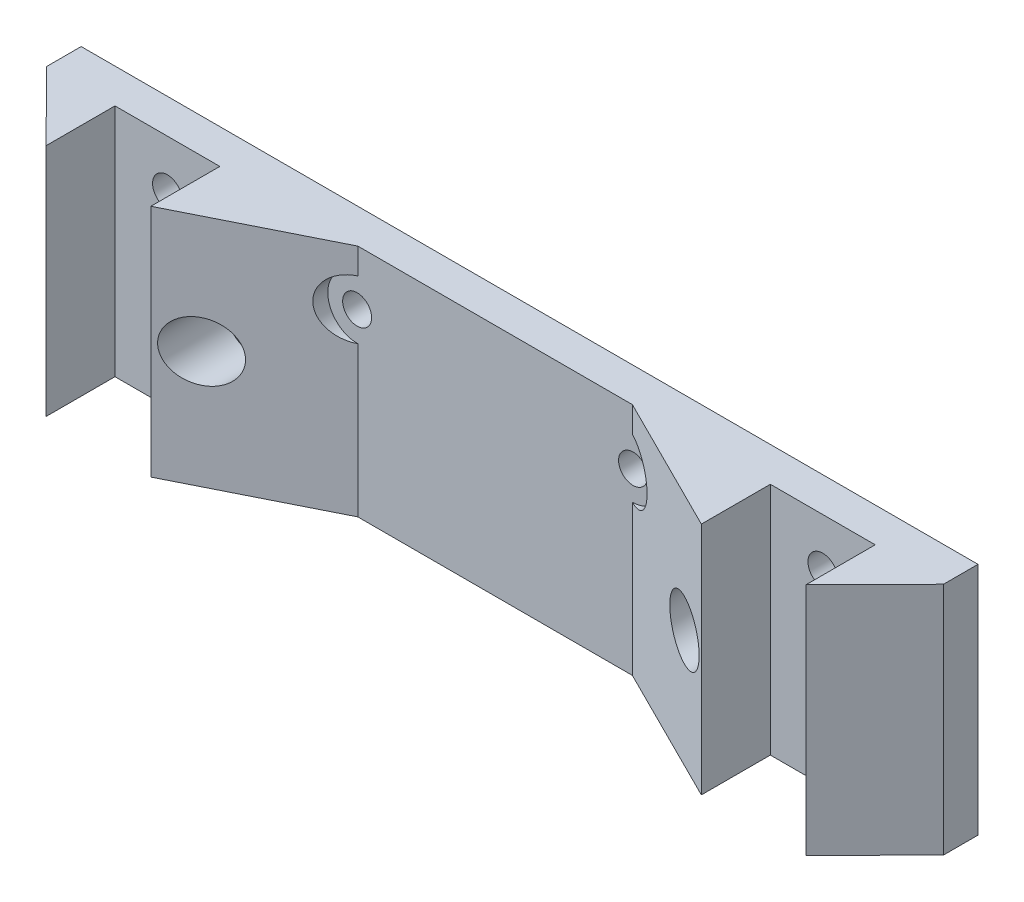
ISO-10303-21;
HEADER;
FILE_DESCRIPTION(('STEP AP214'),'2;1');
FILE_NAME('part.step','',(''),(''),'','','');
FILE_SCHEMA(('AUTOMOTIVE_DESIGN { 1 0 10303 214 1 1 1 1 }'));
ENDSEC;
DATA;
#1=APPLICATION_CONTEXT('core data for automotive mechanical design processes');
#2=APPLICATION_PROTOCOL_DEFINITION('international standard','automotive_design',2000,#1);
#3=PRODUCT_CONTEXT('',#1,'mechanical');
#4=PRODUCT('Part','Part','',(#3));
#5=PRODUCT_RELATED_PRODUCT_CATEGORY('part','',(#4));
#6=PRODUCT_DEFINITION_FORMATION('','',#4);
#7=PRODUCT_DEFINITION_CONTEXT('part definition',#1,'design');
#8=PRODUCT_DEFINITION('design','',#6,#7);
#9=PRODUCT_DEFINITION_SHAPE('','',#8);
#10=(LENGTH_UNIT() NAMED_UNIT(*) SI_UNIT(.MILLI.,.METRE.));
#11=(NAMED_UNIT(*) PLANE_ANGLE_UNIT() SI_UNIT($,.RADIAN.));
#12=(NAMED_UNIT(*) SI_UNIT($,.STERADIAN.) SOLID_ANGLE_UNIT());
#13=UNCERTAINTY_MEASURE_WITH_UNIT(LENGTH_MEASURE(1.E-05),#10,'distance_accuracy_value','');
#14=(GEOMETRIC_REPRESENTATION_CONTEXT(3) GLOBAL_UNCERTAINTY_ASSIGNED_CONTEXT((#13)) GLOBAL_UNIT_ASSIGNED_CONTEXT((#10,
#11,#12)) REPRESENTATION_CONTEXT('',''));
#15=CARTESIAN_POINT('',(0.,0.,0.));
#16=DIRECTION('',(0.,0.,1.));
#17=DIRECTION('',(1.,0.,0.));
#18=AXIS2_PLACEMENT_3D('',#15,#16,#17);
#19=CARTESIAN_POINT('',(-39.8999999999967,110.499923245137,15.));
#20=DIRECTION('',(0.447213595499958,0.,0.894427190999916));
#21=DIRECTION('',(0.894427190999916,0.,-0.447213595499958));
#22=AXIS2_PLACEMENT_3D('',#19,#20,#21);
#23=PLANE('',#22);
#24=DIRECTION('',(0.,-1.,0.));
#25=VECTOR('',#24,1.);
#26=CARTESIAN_POINT('',(-19.8999999999967,110.499923245137,5.));
#27=LINE('',#26,#25);
#28=CARTESIAN_POINT('',(-19.8999999999967,98.2510998786033,5.));
#29=VERTEX_POINT('',#28);
#30=CARTESIAN_POINT('',(-19.8999999999967,76.4999232451366,5.));
#31=VERTEX_POINT('',#30);
#32=EDGE_CURVE('E195',#29,#31,#27,.T.);
#33=ORIENTED_EDGE('',*,*,#32,.F.);
#34=CARTESIAN_POINT('',(-20.0000000000005,102.499923245137,5.05000000000191));
#35=DIRECTION('',(0.447213595499958,0.,0.894427190999916));
#36=DIRECTION('',(0.894427190999916,0.,-0.447213595499958));
#37=AXIS2_PLACEMENT_3D('',#34,#35,#36);
#38=ELLIPSE('',#37,4.75164445218705,4.25);
#39=CARTESIAN_POINT('',(-19.8999999999967,106.74874661167,5.));
#40=VERTEX_POINT('',#39);
#41=EDGE_CURVE('E11',#29,#40,#38,.F.);
#42=ORIENTED_EDGE('',*,*,#41,.T.);
#43=CARTESIAN_POINT('',(-19.8999999999967,110.499923245137,5.));
#44=VERTEX_POINT('',#43);
#45=EDGE_CURVE('E193',#44,#40,#27,.T.);
#46=ORIENTED_EDGE('',*,*,#45,.F.);
#47=DIRECTION('',(-0.894427190999916,0.,0.447213595499958));
#48=VECTOR('',#47,1.);
#49=CARTESIAN_POINT('',(-39.8999999999967,110.499923245137,15.));
#50=LINE('',#49,#48);
#51=CARTESIAN_POINT('',(-39.8999999999967,110.499923245137,15.));
#52=VERTEX_POINT('',#51);
#53=EDGE_CURVE('E180',#44,#52,#50,.T.);
#54=ORIENTED_EDGE('',*,*,#53,.T.);
#55=DIRECTION('',(0.,-1.,0.));
#56=VECTOR('',#55,1.);
#57=CARTESIAN_POINT('',(-39.8999999999967,110.499923245137,15.));
#58=LINE('',#57,#56);
#59=CARTESIAN_POINT('',(-39.8999999999967,76.4999232451366,15.));
#60=VERTEX_POINT('',#59);
#61=EDGE_CURVE('E190',#52,#60,#58,.T.);
#62=ORIENTED_EDGE('',*,*,#61,.T.);
#63=DIRECTION('',(-0.894427190999916,0.,0.447213595499958));
#64=VECTOR('',#63,1.);
#65=CARTESIAN_POINT('',(-39.8999999999967,76.4999232451366,15.));
#66=LINE('',#65,#64);
#67=EDGE_CURVE('E181',#31,#60,#66,.T.);
#68=ORIENTED_EDGE('',*,*,#67,.F.);
#69=EDGE_LOOP('',(#33,#42,#46,#54,#62,#68));
#70=FACE_BOUND('',#69,.T.);
#71=CARTESIAN_POINT('',(-35.0000000000005,93.4999232451367,12.5500000000019));
#72=DIRECTION('',(0.447213595499958,0.,0.894427190999916));
#73=DIRECTION('',(0.894427190999916,0.,-0.447213595499958));
#74=AXIS2_PLACEMENT_3D('',#71,#72,#73);
#75=ELLIPSE('',#74,4.75164445218705,4.25);
#76=CARTESIAN_POINT('',(-30.7500000000005,93.4999232451367,10.4250000000019));
#77=VERTEX_POINT('',#76);
#78=EDGE_CURVE('E39',#77,#77,#75,.F.);
#79=ORIENTED_EDGE('',*,*,#78,.T.);
#80=EDGE_LOOP('',(#79));
#81=FACE_BOUND('',#80,.T.);
#82=ADVANCED_FACE('F35',(#70,#81),#23,.T.);
#83=CARTESIAN_POINT('',(39.8999999999966,110.499923245137,15.0000000000007));
#84=DIRECTION('',(-0.447213595499974,0.,0.894427190999908));
#85=DIRECTION('',(0.894427190999908,0.,0.447213595499974));
#86=AXIS2_PLACEMENT_3D('',#83,#84,#85);
#87=PLANE('',#86);
#88=DIRECTION('',(0.,-1.,0.));
#89=VECTOR('',#88,1.);
#90=CARTESIAN_POINT('',(19.8999999999968,110.499923245137,5.00000000000035));
#91=LINE('',#90,#89);
#92=CARTESIAN_POINT('',(19.8999999999968,110.499923245137,5.00000000000035));
#93=VERTEX_POINT('',#92);
#94=CARTESIAN_POINT('',(19.8999999999968,106.749923245137,5.00000000000035));
#95=VERTEX_POINT('',#94);
#96=EDGE_CURVE('E158',#93,#95,#91,.T.);
#97=ORIENTED_EDGE('',*,*,#96,.T.);
#98=CARTESIAN_POINT('',(19.8999999999965,102.499923245137,5.00000000000018));
#99=DIRECTION('',(-0.447213595499974,0.,0.894427190999908));
#100=DIRECTION('',(-0.894427190999908,0.,-0.447213595499974));
#101=AXIS2_PLACEMENT_3D('',#98,#99,#100);
#102=ELLIPSE('',#101,4.75164445218709,4.25);
#103=CARTESIAN_POINT('',(19.8999999999961,98.2499232451366,5.));
#104=VERTEX_POINT('',#103);
#105=EDGE_CURVE('E44',#95,#104,#102,.F.);
#106=ORIENTED_EDGE('',*,*,#105,.T.);
#107=CARTESIAN_POINT('',(19.8999999999968,76.4999232451366,5.00000000000035));
#108=VERTEX_POINT('',#107);
#109=EDGE_CURVE('E156',#104,#108,#91,.T.);
#110=ORIENTED_EDGE('',*,*,#109,.T.);
#111=DIRECTION('',(-0.894427190999908,0.,-0.447213595499974));
#112=VECTOR('',#111,1.);
#113=CARTESIAN_POINT('',(39.8999999999966,76.4999232451366,15.0000000000007));
#114=LINE('',#113,#112);
#115=CARTESIAN_POINT('',(39.8999999999966,76.4999232451366,15.0000000000007));
#116=VERTEX_POINT('',#115);
#117=EDGE_CURVE('E319',#116,#108,#114,.T.);
#118=ORIENTED_EDGE('',*,*,#117,.F.);
#119=DIRECTION('',(0.,-1.,0.));
#120=VECTOR('',#119,1.);
#121=CARTESIAN_POINT('',(39.8999999999966,110.499923245137,15.0000000000007));
#122=LINE('',#121,#120);
#123=CARTESIAN_POINT('',(39.8999999999966,110.499923245137,15.0000000000007));
#124=VERTEX_POINT('',#123);
#125=EDGE_CURVE('E166',#124,#116,#122,.T.);
#126=ORIENTED_EDGE('',*,*,#125,.F.);
#127=DIRECTION('',(-0.894427190999908,0.,-0.447213595499974));
#128=VECTOR('',#127,1.);
#129=CARTESIAN_POINT('',(39.8999999999966,110.499923245137,15.0000000000007));
#130=LINE('',#129,#128);
#131=EDGE_CURVE('E169',#124,#93,#130,.T.);
#132=ORIENTED_EDGE('',*,*,#131,.T.);
#133=EDGE_LOOP('',(#97,#106,#110,#118,#126,#132));
#134=FACE_BOUND('',#133,.T.);
#135=CARTESIAN_POINT('',(34.9999999999995,93.4999232451367,12.550000000002));
#136=DIRECTION('',(-0.447213595499974,0.,0.894427190999908));
#137=DIRECTION('',(-0.894427190999908,0.,-0.447213595499974));
#138=AXIS2_PLACEMENT_3D('',#135,#136,#137);
#139=ELLIPSE('',#138,4.7516444521871,4.25000000000001);
#140=CARTESIAN_POINT('',(30.7499999999995,93.4999232451367,10.4250000000019));
#141=VERTEX_POINT('',#140);
#142=EDGE_CURVE('E290',#141,#141,#139,.F.);
#143=ORIENTED_EDGE('',*,*,#142,.T.);
#144=EDGE_LOOP('',(#143));
#145=FACE_BOUND('',#144,.T.);
#146=ADVANCED_FACE('F153',(#134,#145),#87,.T.);
#147=CARTESIAN_POINT('',(0.,0.,5.));
#148=DIRECTION('',(0.,0.,1.));
#149=DIRECTION('',(1.,0.,0.));
#150=AXIS2_PLACEMENT_3D('',#147,#148,#149);
#151=PLANE('',#150);
#152=DIRECTION('',(0.,-1.,0.));
#153=VECTOR('',#152,1.);
#154=CARTESIAN_POINT('',(55.0999999999968,110.499923245137,5.00000000000097));
#155=LINE('',#154,#153);
#156=CARTESIAN_POINT('',(55.0999999999968,110.499923245137,5.00000000000097));
#157=VERTEX_POINT('',#156);
#158=CARTESIAN_POINT('',(55.0999999999967,76.4999232451366,5.));
#159=VERTEX_POINT('',#158);
#160=EDGE_CURVE('E311',#157,#159,#155,.T.);
#161=ORIENTED_EDGE('',*,*,#160,.F.);
#162=DIRECTION('',(-1.,0.,0.));
#163=VECTOR('',#162,1.);
#164=CARTESIAN_POINT('',(-64.9999999999966,110.499923245137,5.));
#165=LINE('',#164,#163);
#166=CARTESIAN_POINT('',(39.8999999999968,110.499923245137,5.0000000000007));
#167=VERTEX_POINT('',#166);
#168=EDGE_CURVE('E269',#157,#167,#165,.T.);
#169=ORIENTED_EDGE('',*,*,#168,.T.);
#170=DIRECTION('',(0.,-1.,0.));
#171=VECTOR('',#170,1.);
#172=CARTESIAN_POINT('',(39.8999999999968,110.499923245137,5.0000000000007));
#173=LINE('',#172,#171);
#174=CARTESIAN_POINT('',(39.8999999999968,76.4999232451366,5.0000000000007));
#175=VERTEX_POINT('',#174);
#176=EDGE_CURVE('E168',#167,#175,#173,.T.);
#177=ORIENTED_EDGE('',*,*,#176,.T.);
#178=DIRECTION('',(1.,0.,0.));
#179=VECTOR('',#178,1.);
#180=CARTESIAN_POINT('',(-64.9999999999966,76.4999232451366,5.));
#181=LINE('',#180,#179);
#182=EDGE_CURVE('E260',#175,#159,#181,.T.);
#183=ORIENTED_EDGE('',*,*,#182,.T.);
#184=EDGE_LOOP('',(#161,#169,#177,#183));
#185=FACE_BOUND('',#184,.T.);
#186=CARTESIAN_POINT('',(47.4999999999963,83.4999232451366,5.));
#187=DIRECTION('',(0.,0.,1.));
#188=DIRECTION('',(-1.,0.,0.));
#189=AXIS2_PLACEMENT_3D('',#186,#187,#188);
#190=CIRCLE('',#189,2.15);
#191=CARTESIAN_POINT('',(45.3499999999963,83.4999232451366,5.));
#192=VERTEX_POINT('',#191);
#193=EDGE_CURVE('E222',#192,#192,#190,.T.);
#194=ORIENTED_EDGE('',*,*,#193,.F.);
#195=EDGE_LOOP('',(#194));
#196=FACE_BOUND('',#195,.T.);
#197=CARTESIAN_POINT('',(47.4999999999963,103.499923245137,5.));
#198=DIRECTION('',(0.,0.,1.));
#199=DIRECTION('',(-1.,0.,0.));
#200=AXIS2_PLACEMENT_3D('',#197,#198,#199);
#201=CIRCLE('',#200,2.15);
#202=CARTESIAN_POINT('',(45.3499999999963,103.499923245137,5.));
#203=VERTEX_POINT('',#202);
#204=EDGE_CURVE('E216',#203,#203,#201,.T.);
#205=ORIENTED_EDGE('',*,*,#204,.F.);
#206=EDGE_LOOP('',(#205));
#207=FACE_BOUND('',#206,.T.);
#208=ADVANCED_FACE('F337',(#185,#196,#207),#151,.T.);
#209=DIRECTION('',(0.,-1.,0.));
#210=VECTOR('',#209,1.);
#211=CARTESIAN_POINT('',(-39.8999999999967,110.499923245137,5.));
#212=LINE('',#211,#210);
#213=CARTESIAN_POINT('',(-39.8999999999967,110.499923245137,5.));
#214=VERTEX_POINT('',#213);
#215=CARTESIAN_POINT('',(-39.8999999999967,76.4999232451366,5.));
#216=VERTEX_POINT('',#215);
#217=EDGE_CURVE('E184',#214,#216,#212,.T.);
#218=ORIENTED_EDGE('',*,*,#217,.F.);
#219=CARTESIAN_POINT('',(-55.0999999999967,110.499923245137,5.));
#220=VERTEX_POINT('',#219);
#221=EDGE_CURVE('E268',#214,#220,#165,.T.);
#222=ORIENTED_EDGE('',*,*,#221,.T.);
#223=DIRECTION('',(0.,-1.,0.));
#224=VECTOR('',#223,1.);
#225=CARTESIAN_POINT('',(-55.0999999999967,110.499923245137,5.));
#226=LINE('',#225,#224);
#227=CARTESIAN_POINT('',(-55.0999999999967,76.4999232451366,5.));
#228=VERTEX_POINT('',#227);
#229=EDGE_CURVE('E206',#220,#228,#226,.T.);
#230=ORIENTED_EDGE('',*,*,#229,.T.);
#231=EDGE_CURVE('E262',#228,#216,#181,.T.);
#232=ORIENTED_EDGE('',*,*,#231,.T.);
#233=EDGE_LOOP('',(#218,#222,#230,#232));
#234=FACE_BOUND('',#233,.T.);
#235=CARTESIAN_POINT('',(-47.4999999999967,83.4999232451366,5.));
#236=DIRECTION('',(0.,0.,1.));
#237=DIRECTION('',(1.,0.,0.));
#238=AXIS2_PLACEMENT_3D('',#235,#236,#237);
#239=CIRCLE('',#238,2.15);
#240=CARTESIAN_POINT('',(-45.3499999999967,83.4999232451366,5.));
#241=VERTEX_POINT('',#240);
#242=EDGE_CURVE('E228',#241,#241,#239,.T.);
#243=ORIENTED_EDGE('',*,*,#242,.F.);
#244=EDGE_LOOP('',(#243));
#245=FACE_BOUND('',#244,.T.);
#246=CARTESIAN_POINT('',(-47.4999999999967,103.499923245137,5.));
#247=DIRECTION('',(0.,0.,1.));
#248=DIRECTION('',(1.,0.,0.));
#249=AXIS2_PLACEMENT_3D('',#246,#247,#248);
#250=CIRCLE('',#249,2.15);
#251=CARTESIAN_POINT('',(-45.3499999999967,103.499923245137,5.));
#252=VERTEX_POINT('',#251);
#253=EDGE_CURVE('E234',#252,#252,#250,.T.);
#254=ORIENTED_EDGE('',*,*,#253,.F.);
#255=EDGE_LOOP('',(#254));
#256=FACE_BOUND('',#255,.T.);
#257=ADVANCED_FACE('F371',(#234,#245,#256),#151,.T.);
#258=ORIENTED_EDGE('',*,*,#109,.F.);
#259=CARTESIAN_POINT('',(19.8999999999965,102.499923245137,5.));
#260=DIRECTION('',(0.,0.,1.));
#261=DIRECTION('',(1.,0.,0.));
#262=AXIS2_PLACEMENT_3D('',#259,#260,#261);
#263=CIRCLE('',#262,4.25);
#264=EDGE_CURVE('E58',#104,#95,#263,.T.);
#265=ORIENTED_EDGE('',*,*,#264,.T.);
#266=ORIENTED_EDGE('',*,*,#96,.F.);
#267=EDGE_CURVE('E272',#93,#44,#165,.T.);
#268=ORIENTED_EDGE('',*,*,#267,.T.);
#269=ORIENTED_EDGE('',*,*,#45,.T.);
#270=CARTESIAN_POINT('',(-20.0000000000005,102.499923245137,5.));
#271=DIRECTION('',(0.,0.,1.));
#272=DIRECTION('',(1.,0.,0.));
#273=AXIS2_PLACEMENT_3D('',#270,#271,#272);
#274=CIRCLE('',#273,4.25);
#275=EDGE_CURVE('E51',#40,#29,#274,.T.);
#276=ORIENTED_EDGE('',*,*,#275,.T.);
#277=ORIENTED_EDGE('',*,*,#32,.T.);
#278=EDGE_CURVE('E165',#31,#108,#181,.T.);
#279=ORIENTED_EDGE('',*,*,#278,.T.);
#280=EDGE_LOOP('',(#258,#265,#266,#268,#269,#276,#277,#279));
#281=FACE_BOUND('',#280,.T.);
#282=CARTESIAN_POINT('',(-20.0000000000005,102.499923245137,5.));
#283=DIRECTION('',(0.,0.,1.));
#284=DIRECTION('',(1.,0.,0.));
#285=AXIS2_PLACEMENT_3D('',#282,#283,#284);
#286=CIRCLE('',#285,2.09999999999999);
#287=CARTESIAN_POINT('',(-17.9000000000005,102.499923245137,5.));
#288=VERTEX_POINT('',#287);
#289=EDGE_CURVE('E240',#288,#288,#286,.T.);
#290=ORIENTED_EDGE('',*,*,#289,.F.);
#291=EDGE_LOOP('',(#290));
#292=FACE_BOUND('',#291,.T.);
#293=CARTESIAN_POINT('',(19.9999999999995,102.499923245137,5.));
#294=DIRECTION('',(0.,0.,1.));
#295=DIRECTION('',(1.,0.,0.));
#296=AXIS2_PLACEMENT_3D('',#293,#294,#295);
#297=CIRCLE('',#296,2.09999999999999);
#298=CARTESIAN_POINT('',(22.0999999999995,102.499923245137,5.));
#299=VERTEX_POINT('',#298);
#300=EDGE_CURVE('E249',#299,#299,#297,.T.);
#301=ORIENTED_EDGE('',*,*,#300,.F.);
#302=EDGE_LOOP('',(#301));
#303=FACE_BOUND('',#302,.T.);
#304=ADVANCED_FACE('F162',(#281,#292,#303),#151,.T.);
#305=CARTESIAN_POINT('',(0.,0.,0.));
#306=DIRECTION('',(0.,0.,1.));
#307=DIRECTION('',(1.,0.,0.));
#308=AXIS2_PLACEMENT_3D('',#305,#306,#307);
#309=PLANE('',#308);
#310=DIRECTION('',(0.,-1.,0.));
#311=VECTOR('',#310,1.);
#312=CARTESIAN_POINT('',(-64.9999999999966,110.499923245137,0.));
#313=LINE('',#312,#311);
#314=CARTESIAN_POINT('',(-64.9999999999966,110.499923245137,0.));
#315=VERTEX_POINT('',#314);
#316=CARTESIAN_POINT('',(-64.9999999999966,76.4999232451366,0.));
#317=VERTEX_POINT('',#316);
#318=EDGE_CURVE('E257',#315,#317,#313,.T.);
#319=ORIENTED_EDGE('',*,*,#318,.F.);
#320=DIRECTION('',(-1.,0.,0.));
#321=VECTOR('',#320,1.);
#322=CARTESIAN_POINT('',(-64.9999999999966,110.499923245137,0.));
#323=LINE('',#322,#321);
#324=CARTESIAN_POINT('',(64.9999999999962,110.499923245137,0.));
#325=VERTEX_POINT('',#324);
#326=EDGE_CURVE('E261',#325,#315,#323,.T.);
#327=ORIENTED_EDGE('',*,*,#326,.F.);
#328=DIRECTION('',(0.,1.,0.));
#329=VECTOR('',#328,1.);
#330=CARTESIAN_POINT('',(64.9999999999962,110.499923245137,0.));
#331=LINE('',#330,#329);
#332=CARTESIAN_POINT('',(64.9999999999962,76.4999232451366,0.));
#333=VERTEX_POINT('',#332);
#334=EDGE_CURVE('E277',#333,#325,#331,.T.);
#335=ORIENTED_EDGE('',*,*,#334,.F.);
#336=DIRECTION('',(1.,0.,0.));
#337=VECTOR('',#336,1.);
#338=CARTESIAN_POINT('',(-64.9999999999966,76.4999232451366,0.));
#339=LINE('',#338,#337);
#340=EDGE_CURVE('E275',#317,#333,#339,.T.);
#341=ORIENTED_EDGE('',*,*,#340,.F.);
#342=EDGE_LOOP('',(#319,#327,#335,#341));
#343=FACE_BOUND('',#342,.T.);
#344=CARTESIAN_POINT('',(34.9999999999995,93.4999232451367,0.));
#345=DIRECTION('',(0.,0.,1.));
#346=DIRECTION('',(1.,0.,0.));
#347=AXIS2_PLACEMENT_3D('',#344,#345,#346);
#348=CIRCLE('',#347,2.09999999999999);
#349=CARTESIAN_POINT('',(37.0999999999995,93.4999232451367,0.));
#350=VERTEX_POINT('',#349);
#351=EDGE_CURVE('E252',#350,#350,#348,.T.);
#352=ORIENTED_EDGE('',*,*,#351,.T.);
#353=EDGE_LOOP('',(#352));
#354=FACE_BOUND('',#353,.T.);
#355=CARTESIAN_POINT('',(19.9999999999995,102.499923245137,0.));
#356=DIRECTION('',(0.,0.,1.));
#357=DIRECTION('',(1.,0.,0.));
#358=AXIS2_PLACEMENT_3D('',#355,#356,#357);
#359=CIRCLE('',#358,2.09999999999999);
#360=CARTESIAN_POINT('',(22.0999999999995,102.499923245137,0.));
#361=VERTEX_POINT('',#360);
#362=EDGE_CURVE('E248',#361,#361,#359,.T.);
#363=ORIENTED_EDGE('',*,*,#362,.T.);
#364=EDGE_LOOP('',(#363));
#365=FACE_BOUND('',#364,.T.);
#366=CARTESIAN_POINT('',(-35.0000000000005,93.4999232451367,0.));
#367=DIRECTION('',(0.,0.,1.));
#368=DIRECTION('',(1.,0.,0.));
#369=AXIS2_PLACEMENT_3D('',#366,#367,#368);
#370=CIRCLE('',#369,2.09999999999999);
#371=CARTESIAN_POINT('',(-32.9000000000005,93.4999232451367,0.));
#372=VERTEX_POINT('',#371);
#373=EDGE_CURVE('E243',#372,#372,#370,.T.);
#374=ORIENTED_EDGE('',*,*,#373,.T.);
#375=EDGE_LOOP('',(#374));
#376=FACE_BOUND('',#375,.T.);
#377=CARTESIAN_POINT('',(-20.0000000000005,102.499923245137,0.));
#378=DIRECTION('',(0.,0.,1.));
#379=DIRECTION('',(1.,0.,0.));
#380=AXIS2_PLACEMENT_3D('',#377,#378,#379);
#381=CIRCLE('',#380,2.09999999999999);
#382=CARTESIAN_POINT('',(-17.9000000000005,102.499923245137,0.));
#383=VERTEX_POINT('',#382);
#384=EDGE_CURVE('E237',#383,#383,#381,.T.);
#385=ORIENTED_EDGE('',*,*,#384,.T.);
#386=EDGE_LOOP('',(#385));
#387=FACE_BOUND('',#386,.T.);
#388=CARTESIAN_POINT('',(-47.4999999999967,103.499923245137,0.));
#389=DIRECTION('',(0.,0.,1.));
#390=DIRECTION('',(1.,0.,0.));
#391=AXIS2_PLACEMENT_3D('',#388,#389,#390);
#392=CIRCLE('',#391,2.15);
#393=CARTESIAN_POINT('',(-45.3499999999967,103.499923245137,0.));
#394=VERTEX_POINT('',#393);
#395=EDGE_CURVE('E231',#394,#394,#392,.T.);
#396=ORIENTED_EDGE('',*,*,#395,.T.);
#397=EDGE_LOOP('',(#396));
#398=FACE_BOUND('',#397,.T.);
#399=CARTESIAN_POINT('',(-47.4999999999967,83.4999232451366,0.));
#400=DIRECTION('',(0.,0.,1.));
#401=DIRECTION('',(1.,0.,0.));
#402=AXIS2_PLACEMENT_3D('',#399,#400,#401);
#403=CIRCLE('',#402,2.15);
#404=CARTESIAN_POINT('',(-45.3499999999967,83.4999232451366,0.));
#405=VERTEX_POINT('',#404);
#406=EDGE_CURVE('E225',#405,#405,#403,.T.);
#407=ORIENTED_EDGE('',*,*,#406,.T.);
#408=EDGE_LOOP('',(#407));
#409=FACE_BOUND('',#408,.T.);
#410=CARTESIAN_POINT('',(47.4999999999963,83.4999232451366,0.));
#411=DIRECTION('',(0.,0.,1.));
#412=DIRECTION('',(-1.,0.,0.));
#413=AXIS2_PLACEMENT_3D('',#410,#411,#412);
#414=CIRCLE('',#413,2.15);
#415=CARTESIAN_POINT('',(45.3499999999963,83.4999232451366,0.));
#416=VERTEX_POINT('',#415);
#417=EDGE_CURVE('E219',#416,#416,#414,.T.);
#418=ORIENTED_EDGE('',*,*,#417,.T.);
#419=EDGE_LOOP('',(#418));
#420=FACE_BOUND('',#419,.T.);
#421=CARTESIAN_POINT('',(47.4999999999963,103.499923245137,0.));
#422=DIRECTION('',(0.,0.,1.));
#423=DIRECTION('',(-1.,0.,0.));
#424=AXIS2_PLACEMENT_3D('',#421,#422,#423);
#425=CIRCLE('',#424,2.15);
#426=CARTESIAN_POINT('',(45.3499999999963,103.499923245137,0.));
#427=VERTEX_POINT('',#426);
#428=EDGE_CURVE('E213',#427,#427,#425,.T.);
#429=ORIENTED_EDGE('',*,*,#428,.T.);
#430=EDGE_LOOP('',(#429));
#431=FACE_BOUND('',#430,.T.);
#432=ADVANCED_FACE('F354',(#343,#354,#365,#376,#387,#398,#409,#420,#431),#309,.F.);
#433=CARTESIAN_POINT('',(-64.9999999999966,110.499923245137,5.));
#434=DIRECTION('',(1.,0.,0.));
#435=DIRECTION('',(0.,0.,-1.));
#436=AXIS2_PLACEMENT_3D('',#433,#434,#435);
#437=PLANE('',#436);
#438=ORIENTED_EDGE('',*,*,#318,.T.);
#439=DIRECTION('',(0.,0.,-1.));
#440=VECTOR('',#439,1.);
#441=CARTESIAN_POINT('',(-64.9999999999966,76.4999232451366,5.));
#442=LINE('',#441,#440);
#443=CARTESIAN_POINT('',(-64.9999999999966,76.4999232451366,5.));
#444=VERTEX_POINT('',#443);
#445=EDGE_CURVE('E159',#444,#317,#442,.T.);
#446=ORIENTED_EDGE('',*,*,#445,.F.);
#447=DIRECTION('',(0.,-1.,0.));
#448=VECTOR('',#447,1.);
#449=CARTESIAN_POINT('',(-64.9999999999966,110.499923245137,5.));
#450=LINE('',#449,#448);
#451=CARTESIAN_POINT('',(-64.9999999999966,110.499923245137,5.));
#452=VERTEX_POINT('',#451);
#453=EDGE_CURVE('E258',#452,#444,#450,.T.);
#454=ORIENTED_EDGE('',*,*,#453,.F.);
#455=DIRECTION('',(0.,0.,-1.));
#456=VECTOR('',#455,1.);
#457=CARTESIAN_POINT('',(-64.9999999999966,110.499923245137,5.));
#458=LINE('',#457,#456);
#459=EDGE_CURVE('E271',#452,#315,#458,.T.);
#460=ORIENTED_EDGE('',*,*,#459,.T.);
#461=EDGE_LOOP('',(#438,#446,#454,#460));
#462=FACE_BOUND('',#461,.T.);
#463=ADVANCED_FACE('F37',(#462),#437,.F.);
#464=CARTESIAN_POINT('',(-64.9999999999966,76.4999232451366,5.));
#465=DIRECTION('',(0.,1.,0.));
#466=DIRECTION('',(0.,0.,1.));
#467=AXIS2_PLACEMENT_3D('',#464,#465,#466);
#468=PLANE('',#467);
#469=ORIENTED_EDGE('',*,*,#340,.T.);
#470=DIRECTION('',(0.,0.,-1.));
#471=VECTOR('',#470,1.);
#472=CARTESIAN_POINT('',(64.9999999999962,76.4999232451366,5.));
#473=LINE('',#472,#471);
#474=CARTESIAN_POINT('',(64.9999999999962,76.4999232451366,5.));
#475=VERTEX_POINT('',#474);
#476=EDGE_CURVE('E285',#475,#333,#473,.T.);
#477=ORIENTED_EDGE('',*,*,#476,.F.);
#478=DIRECTION('',(-0.703544597920117,0.,0.710651109010196));
#479=VECTOR('',#478,1.);
#480=CARTESIAN_POINT('',(64.9999999999968,76.4999232451366,5.00000000000114));
#481=LINE('',#480,#479);
#482=CARTESIAN_POINT('',(55.0999999999967,76.4999232451366,15.000000000001));
#483=VERTEX_POINT('',#482);
#484=EDGE_CURVE('E199',#475,#483,#481,.T.);
#485=ORIENTED_EDGE('',*,*,#484,.T.);
#486=DIRECTION('',(0.,0.,-1.));
#487=VECTOR('',#486,1.);
#488=CARTESIAN_POINT('',(55.0999999999968,76.4999232451366,5.00000000000097));
#489=LINE('',#488,#487);
#490=EDGE_CURVE('E303',#483,#159,#489,.T.);
#491=ORIENTED_EDGE('',*,*,#490,.T.);
#492=ORIENTED_EDGE('',*,*,#182,.F.);
#493=DIRECTION('',(0.,0.,1.));
#494=VECTOR('',#493,1.);
#495=CARTESIAN_POINT('',(39.8999999999968,76.4999232451366,5.0000000000007));
#496=LINE('',#495,#494);
#497=EDGE_CURVE('E314',#175,#116,#496,.T.);
#498=ORIENTED_EDGE('',*,*,#497,.T.);
#499=ORIENTED_EDGE('',*,*,#117,.T.);
#500=ORIENTED_EDGE('',*,*,#278,.F.);
#501=ORIENTED_EDGE('',*,*,#67,.T.);
#502=DIRECTION('',(0.,0.,-1.));
#503=VECTOR('',#502,1.);
#504=CARTESIAN_POINT('',(-39.8999999999967,76.4999232451366,5.));
#505=LINE('',#504,#503);
#506=EDGE_CURVE('E185',#60,#216,#505,.T.);
#507=ORIENTED_EDGE('',*,*,#506,.T.);
#508=ORIENTED_EDGE('',*,*,#231,.F.);
#509=DIRECTION('',(0.,0.,1.));
#510=VECTOR('',#509,1.);
#511=CARTESIAN_POINT('',(-55.0999999999967,76.4999232451366,5.));
#512=LINE('',#511,#510);
#513=CARTESIAN_POINT('',(-55.0999999999967,76.4999232451366,15.));
#514=VERTEX_POINT('',#513);
#515=EDGE_CURVE('E203',#228,#514,#512,.T.);
#516=ORIENTED_EDGE('',*,*,#515,.T.);
#517=DIRECTION('',(-0.703544597920104,0.,-0.710651109010208));
#518=VECTOR('',#517,1.);
#519=CARTESIAN_POINT('',(-64.9999999999966,76.4999232451366,5.));
#520=LINE('',#519,#518);
#521=EDGE_CURVE('E192',#514,#444,#520,.T.);
#522=ORIENTED_EDGE('',*,*,#521,.T.);
#523=ORIENTED_EDGE('',*,*,#445,.T.);
#524=EDGE_LOOP('',(#469,#477,#485,#491,#492,#498,#499,#500,#501,#507,#508,#516,#522,#523));
#525=FACE_BOUND('',#524,.T.);
#526=ADVANCED_FACE('F323',(#525),#468,.F.);
#527=CARTESIAN_POINT('',(64.9999999999962,110.499923245137,5.));
#528=DIRECTION('',(-1.,0.,0.));
#529=DIRECTION('',(0.,0.,1.));
#530=AXIS2_PLACEMENT_3D('',#527,#528,#529);
#531=PLANE('',#530);
#532=ORIENTED_EDGE('',*,*,#334,.T.);
#533=DIRECTION('',(0.,0.,-1.));
#534=VECTOR('',#533,1.);
#535=CARTESIAN_POINT('',(64.9999999999962,110.499923245137,5.));
#536=LINE('',#535,#534);
#537=CARTESIAN_POINT('',(64.9999999999962,110.499923245137,5.));
#538=VERTEX_POINT('',#537);
#539=EDGE_CURVE('E282',#538,#325,#536,.T.);
#540=ORIENTED_EDGE('',*,*,#539,.F.);
#541=DIRECTION('',(0.,1.,0.));
#542=VECTOR('',#541,1.);
#543=CARTESIAN_POINT('',(64.9999999999962,110.499923245137,5.));
#544=LINE('',#543,#542);
#545=EDGE_CURVE('E265',#475,#538,#544,.T.);
#546=ORIENTED_EDGE('',*,*,#545,.F.);
#547=ORIENTED_EDGE('',*,*,#476,.T.);
#548=EDGE_LOOP('',(#532,#540,#546,#547));
#549=FACE_BOUND('',#548,.T.);
#550=ADVANCED_FACE('F350',(#549),#531,.F.);
#551=CARTESIAN_POINT('',(-64.9999999999966,110.499923245137,5.));
#552=DIRECTION('',(0.,-1.,0.));
#553=DIRECTION('',(1.,0.,0.));
#554=AXIS2_PLACEMENT_3D('',#551,#552,#553);
#555=PLANE('',#554);
#556=ORIENTED_EDGE('',*,*,#326,.T.);
#557=ORIENTED_EDGE('',*,*,#459,.F.);
#558=DIRECTION('',(-0.703544597920104,0.,-0.710651109010208));
#559=VECTOR('',#558,1.);
#560=CARTESIAN_POINT('',(-64.9999999999966,110.499923245137,5.));
#561=LINE('',#560,#559);
#562=CARTESIAN_POINT('',(-55.0999999999967,110.499923245137,15.));
#563=VERTEX_POINT('',#562);
#564=EDGE_CURVE('E200',#563,#452,#561,.T.);
#565=ORIENTED_EDGE('',*,*,#564,.F.);
#566=DIRECTION('',(0.,0.,1.));
#567=VECTOR('',#566,1.);
#568=CARTESIAN_POINT('',(-55.0999999999967,110.499923245137,5.));
#569=LINE('',#568,#567);
#570=EDGE_CURVE('E202',#220,#563,#569,.T.);
#571=ORIENTED_EDGE('',*,*,#570,.F.);
#572=ORIENTED_EDGE('',*,*,#221,.F.);
#573=DIRECTION('',(0.,0.,-1.));
#574=VECTOR('',#573,1.);
#575=CARTESIAN_POINT('',(-39.8999999999967,110.499923245137,5.));
#576=LINE('',#575,#574);
#577=EDGE_CURVE('E178',#52,#214,#576,.T.);
#578=ORIENTED_EDGE('',*,*,#577,.F.);
#579=ORIENTED_EDGE('',*,*,#53,.F.);
#580=ORIENTED_EDGE('',*,*,#267,.F.);
#581=ORIENTED_EDGE('',*,*,#131,.F.);
#582=DIRECTION('',(0.,0.,1.));
#583=VECTOR('',#582,1.);
#584=CARTESIAN_POINT('',(39.8999999999968,110.499923245137,5.0000000000007));
#585=LINE('',#584,#583);
#586=EDGE_CURVE('E316',#167,#124,#585,.T.);
#587=ORIENTED_EDGE('',*,*,#586,.F.);
#588=ORIENTED_EDGE('',*,*,#168,.F.);
#589=DIRECTION('',(0.,0.,-1.));
#590=VECTOR('',#589,1.);
#591=CARTESIAN_POINT('',(55.0999999999968,110.499923245137,5.00000000000097));
#592=LINE('',#591,#590);
#593=CARTESIAN_POINT('',(55.0999999999967,110.499923245137,15.000000000001));
#594=VERTEX_POINT('',#593);
#595=EDGE_CURVE('E302',#594,#157,#592,.T.);
#596=ORIENTED_EDGE('',*,*,#595,.F.);
#597=DIRECTION('',(-0.703544597920117,0.,0.710651109010196));
#598=VECTOR('',#597,1.);
#599=CARTESIAN_POINT('',(64.9999999999968,110.499923245137,5.00000000000114));
#600=LINE('',#599,#598);
#601=EDGE_CURVE('E299',#538,#594,#600,.T.);
#602=ORIENTED_EDGE('',*,*,#601,.F.);
#603=ORIENTED_EDGE('',*,*,#539,.T.);
#604=EDGE_LOOP('',(#556,#557,#565,#571,#572,#578,#579,#580,#581,#587,#588,#596,#602,#603));
#605=FACE_BOUND('',#604,.T.);
#606=ADVANCED_FACE('F330',(#605),#555,.F.);
#607=CARTESIAN_POINT('',(34.9999999999995,93.4999232451367,5.));
#608=DIRECTION('',(0.,0.,-1.));
#609=DIRECTION('',(-1.,0.,0.));
#610=AXIS2_PLACEMENT_3D('',#607,#608,#609);
#611=CYLINDRICAL_SURFACE('',#610,2.09999999999999);
#612=CARTESIAN_POINT('',(34.9999999999995,93.4999232451367,5.00000000000061));
#613=DIRECTION('',(0.,0.,-1.));
#614=DIRECTION('',(-1.,0.,0.));
#615=AXIS2_PLACEMENT_3D('',#612,#613,#614);
#616=CIRCLE('',#615,2.09999999999999);
#617=CARTESIAN_POINT('',(32.8999999999995,93.4999232451367,5.00000000000058));
#618=VERTEX_POINT('',#617);
#619=EDGE_CURVE('E174',#618,#618,#616,.T.);
#620=ORIENTED_EDGE('',*,*,#619,.F.);
#621=EDGE_LOOP('',(#620));
#622=FACE_BOUND('',#621,.T.);
#623=ORIENTED_EDGE('',*,*,#351,.F.);
#624=EDGE_LOOP('',(#623));
#625=FACE_BOUND('',#624,.T.);
#626=ADVANCED_FACE('F521',(#622,#625),#611,.F.);
#627=CARTESIAN_POINT('',(19.9999999999995,102.499923245137,5.));
#628=DIRECTION('',(0.,0.,-1.));
#629=DIRECTION('',(-1.,0.,0.));
#630=AXIS2_PLACEMENT_3D('',#627,#628,#629);
#631=CYLINDRICAL_SURFACE('',#630,2.09999999999999);
#632=ORIENTED_EDGE('',*,*,#300,.T.);
#633=EDGE_LOOP('',(#632));
#634=FACE_BOUND('',#633,.T.);
#635=ORIENTED_EDGE('',*,*,#362,.F.);
#636=EDGE_LOOP('',(#635));
#637=FACE_BOUND('',#636,.T.);
#638=ADVANCED_FACE('F618',(#634,#637),#631,.F.);
#639=CARTESIAN_POINT('',(-35.0000000000005,93.4999232451367,5.));
#640=DIRECTION('',(0.,0.,-1.));
#641=DIRECTION('',(-1.,0.,0.));
#642=AXIS2_PLACEMENT_3D('',#639,#640,#641);
#643=CYLINDRICAL_SURFACE('',#642,2.09999999999999);
#644=CARTESIAN_POINT('',(-35.0000000000005,93.4999232451367,5.));
#645=DIRECTION('',(0.,0.,-1.));
#646=DIRECTION('',(-1.,0.,0.));
#647=AXIS2_PLACEMENT_3D('',#644,#645,#646);
#648=CIRCLE('',#647,2.09999999999999);
#649=CARTESIAN_POINT('',(-37.1000000000005,93.4999232451367,5.));
#650=VERTEX_POINT('',#649);
#651=EDGE_CURVE('E177',#650,#650,#648,.T.);
#652=ORIENTED_EDGE('',*,*,#651,.F.);
#653=EDGE_LOOP('',(#652));
#654=FACE_BOUND('',#653,.T.);
#655=ORIENTED_EDGE('',*,*,#373,.F.);
#656=EDGE_LOOP('',(#655));
#657=FACE_BOUND('',#656,.T.);
#658=ADVANCED_FACE('F613',(#654,#657),#643,.F.);
#659=CARTESIAN_POINT('',(-20.0000000000005,102.499923245137,5.));
#660=DIRECTION('',(0.,0.,-1.));
#661=DIRECTION('',(-1.,0.,0.));
#662=AXIS2_PLACEMENT_3D('',#659,#660,#661);
#663=CYLINDRICAL_SURFACE('',#662,2.09999999999999);
#664=ORIENTED_EDGE('',*,*,#289,.T.);
#665=EDGE_LOOP('',(#664));
#666=FACE_BOUND('',#665,.T.);
#667=ORIENTED_EDGE('',*,*,#384,.F.);
#668=EDGE_LOOP('',(#667));
#669=FACE_BOUND('',#668,.T.);
#670=ADVANCED_FACE('F605',(#666,#669),#663,.F.);
#671=CARTESIAN_POINT('',(-47.4999999999967,103.499923245137,5.));
#672=DIRECTION('',(0.,0.,-1.));
#673=DIRECTION('',(-1.,0.,0.));
#674=AXIS2_PLACEMENT_3D('',#671,#672,#673);
#675=CYLINDRICAL_SURFACE('',#674,2.15);
#676=ORIENTED_EDGE('',*,*,#253,.T.);
#677=EDGE_LOOP('',(#676));
#678=FACE_BOUND('',#677,.T.);
#679=ORIENTED_EDGE('',*,*,#395,.F.);
#680=EDGE_LOOP('',(#679));
#681=FACE_BOUND('',#680,.T.);
#682=ADVANCED_FACE('F595',(#678,#681),#675,.F.);
#683=CARTESIAN_POINT('',(-47.4999999999967,83.4999232451366,5.));
#684=DIRECTION('',(0.,0.,-1.));
#685=DIRECTION('',(-1.,0.,0.));
#686=AXIS2_PLACEMENT_3D('',#683,#684,#685);
#687=CYLINDRICAL_SURFACE('',#686,2.15);
#688=ORIENTED_EDGE('',*,*,#242,.T.);
#689=EDGE_LOOP('',(#688));
#690=FACE_BOUND('',#689,.T.);
#691=ORIENTED_EDGE('',*,*,#406,.F.);
#692=EDGE_LOOP('',(#691));
#693=FACE_BOUND('',#692,.T.);
#694=ADVANCED_FACE('F585',(#690,#693),#687,.F.);
#695=CARTESIAN_POINT('',(47.4999999999963,83.4999232451366,5.));
#696=DIRECTION('',(0.,0.,-1.));
#697=DIRECTION('',(-1.,0.,0.));
#698=AXIS2_PLACEMENT_3D('',#695,#696,#697);
#699=CYLINDRICAL_SURFACE('',#698,2.15);
#700=ORIENTED_EDGE('',*,*,#193,.T.);
#701=EDGE_LOOP('',(#700));
#702=FACE_BOUND('',#701,.T.);
#703=ORIENTED_EDGE('',*,*,#417,.F.);
#704=EDGE_LOOP('',(#703));
#705=FACE_BOUND('',#704,.T.);
#706=ADVANCED_FACE('F575',(#702,#705),#699,.F.);
#707=CARTESIAN_POINT('',(47.4999999999963,103.499923245137,5.));
#708=DIRECTION('',(0.,0.,-1.));
#709=DIRECTION('',(-1.,0.,0.));
#710=AXIS2_PLACEMENT_3D('',#707,#708,#709);
#711=CYLINDRICAL_SURFACE('',#710,2.15);
#712=ORIENTED_EDGE('',*,*,#204,.T.);
#713=EDGE_LOOP('',(#712));
#714=FACE_BOUND('',#713,.T.);
#715=ORIENTED_EDGE('',*,*,#428,.F.);
#716=EDGE_LOOP('',(#715));
#717=FACE_BOUND('',#716,.T.);
#718=ADVANCED_FACE('F513',(#714,#717),#711,.F.);
#719=CARTESIAN_POINT('',(-64.9999999999966,110.499923245137,5.));
#720=DIRECTION('',(-0.710651109010208,0.,0.703544597920105));
#721=DIRECTION('',(0.703544597920104,0.,0.710651109010208));
#722=AXIS2_PLACEMENT_3D('',#719,#720,#721);
#723=PLANE('',#722);
#724=ORIENTED_EDGE('',*,*,#521,.F.);
#725=DIRECTION('',(0.,-1.,0.));
#726=VECTOR('',#725,1.);
#727=CARTESIAN_POINT('',(-55.0999999999967,110.499923245137,15.));
#728=LINE('',#727,#726);
#729=EDGE_CURVE('E211',#563,#514,#728,.T.);
#730=ORIENTED_EDGE('',*,*,#729,.F.);
#731=ORIENTED_EDGE('',*,*,#564,.T.);
#732=ORIENTED_EDGE('',*,*,#453,.T.);
#733=EDGE_LOOP('',(#724,#730,#731,#732));
#734=FACE_BOUND('',#733,.T.);
#735=ADVANCED_FACE('F363',(#734),#723,.T.);
#736=CARTESIAN_POINT('',(-55.0999999999967,110.499923245137,5.));
#737=DIRECTION('',(1.,0.,0.));
#738=DIRECTION('',(0.,0.,-1.));
#739=AXIS2_PLACEMENT_3D('',#736,#737,#738);
#740=PLANE('',#739);
#741=ORIENTED_EDGE('',*,*,#515,.F.);
#742=ORIENTED_EDGE('',*,*,#229,.F.);
#743=ORIENTED_EDGE('',*,*,#570,.T.);
#744=ORIENTED_EDGE('',*,*,#729,.T.);
#745=EDGE_LOOP('',(#741,#742,#743,#744));
#746=FACE_BOUND('',#745,.T.);
#747=ADVANCED_FACE('F367',(#746),#740,.T.);
#748=CARTESIAN_POINT('',(-39.8999999999967,110.499923245137,5.));
#749=DIRECTION('',(-1.,0.,0.));
#750=DIRECTION('',(0.,0.,1.));
#751=AXIS2_PLACEMENT_3D('',#748,#749,#750);
#752=PLANE('',#751);
#753=ORIENTED_EDGE('',*,*,#506,.F.);
#754=ORIENTED_EDGE('',*,*,#61,.F.);
#755=ORIENTED_EDGE('',*,*,#577,.T.);
#756=ORIENTED_EDGE('',*,*,#217,.T.);
#757=EDGE_LOOP('',(#753,#754,#755,#756));
#758=FACE_BOUND('',#757,.T.);
#759=ADVANCED_FACE('F381',(#758),#752,.T.);
#760=CARTESIAN_POINT('',(39.8999999999968,110.499923245137,5.0000000000007));
#761=DIRECTION('',(1.,0.,0.));
#762=DIRECTION('',(0.,0.,-1.));
#763=AXIS2_PLACEMENT_3D('',#760,#761,#762);
#764=PLANE('',#763);
#765=ORIENTED_EDGE('',*,*,#497,.F.);
#766=ORIENTED_EDGE('',*,*,#176,.F.);
#767=ORIENTED_EDGE('',*,*,#586,.T.);
#768=ORIENTED_EDGE('',*,*,#125,.T.);
#769=EDGE_LOOP('',(#765,#766,#767,#768));
#770=FACE_BOUND('',#769,.T.);
#771=ADVANCED_FACE('F333',(#770),#764,.T.);
#772=CARTESIAN_POINT('',(55.0999999999968,110.499923245137,5.00000000000097));
#773=DIRECTION('',(-1.,0.,0.));
#774=DIRECTION('',(0.,0.,1.));
#775=AXIS2_PLACEMENT_3D('',#772,#773,#774);
#776=PLANE('',#775);
#777=ORIENTED_EDGE('',*,*,#490,.F.);
#778=DIRECTION('',(0.,-1.,0.));
#779=VECTOR('',#778,1.);
#780=CARTESIAN_POINT('',(55.0999999999967,110.499923245137,15.000000000001));
#781=LINE('',#780,#779);
#782=EDGE_CURVE('E306',#594,#483,#781,.T.);
#783=ORIENTED_EDGE('',*,*,#782,.F.);
#784=ORIENTED_EDGE('',*,*,#595,.T.);
#785=ORIENTED_EDGE('',*,*,#160,.T.);
#786=EDGE_LOOP('',(#777,#783,#784,#785));
#787=FACE_BOUND('',#786,.T.);
#788=ADVANCED_FACE('F342',(#787),#776,.T.);
#789=CARTESIAN_POINT('',(64.9999999999968,110.499923245137,5.00000000000114));
#790=DIRECTION('',(0.710651109010195,0.,0.703544597920117));
#791=DIRECTION('',(0.703544597920117,0.,-0.710651109010195));
#792=AXIS2_PLACEMENT_3D('',#789,#790,#791);
#793=PLANE('',#792);
#794=ORIENTED_EDGE('',*,*,#484,.F.);
#795=ORIENTED_EDGE('',*,*,#545,.T.);
#796=ORIENTED_EDGE('',*,*,#601,.T.);
#797=ORIENTED_EDGE('',*,*,#782,.T.);
#798=EDGE_LOOP('',(#794,#795,#796,#797));
#799=FACE_BOUND('',#798,.T.);
#800=ADVANCED_FACE('F347',(#799),#793,.T.);
#801=CARTESIAN_POINT('',(19.8999999999965,102.499923245137,39.));
#802=DIRECTION('',(0.,0.,-1.));
#803=DIRECTION('',(-1.,0.,0.));
#804=AXIS2_PLACEMENT_3D('',#801,#802,#803);
#805=CYLINDRICAL_SURFACE('',#804,4.25);
#806=ORIENTED_EDGE('',*,*,#264,.F.);
#807=ORIENTED_EDGE('',*,*,#105,.F.);
#808=EDGE_LOOP('',(#806,#807));
#809=FACE_BOUND('',#808,.T.);
#810=ADVANCED_FACE('F148',(#809),#805,.F.);
#811=CARTESIAN_POINT('',(34.9999999999995,93.4999232451367,5.));
#812=DIRECTION('',(0.,0.,1.));
#813=DIRECTION('',(1.,0.,0.));
#814=AXIS2_PLACEMENT_3D('',#811,#812,#813);
#815=PLANE('',#814);
#816=CARTESIAN_POINT('',(34.9999999999995,93.4999232451367,5.));
#817=DIRECTION('',(0.,0.,1.));
#818=DIRECTION('',(1.,0.,0.));
#819=AXIS2_PLACEMENT_3D('',#816,#817,#818);
#820=CIRCLE('',#819,4.25000000000001);
#821=CARTESIAN_POINT('',(39.2499999999995,93.4999232451367,5.));
#822=VERTEX_POINT('',#821);
#823=EDGE_CURVE('E297',#822,#822,#820,.T.);
#824=ORIENTED_EDGE('',*,*,#823,.T.);
#825=EDGE_LOOP('',(#824));
#826=FACE_BOUND('',#825,.T.);
#827=ORIENTED_EDGE('',*,*,#619,.T.);
#828=EDGE_LOOP('',(#827));
#829=FACE_BOUND('',#828,.T.);
#830=ADVANCED_FACE('F410',(#826,#829),#815,.T.);
#831=CARTESIAN_POINT('',(34.9999999999995,93.4999232451367,39.));
#832=DIRECTION('',(0.,0.,-1.));
#833=DIRECTION('',(-1.,0.,0.));
#834=AXIS2_PLACEMENT_3D('',#831,#832,#833);
#835=CYLINDRICAL_SURFACE('',#834,4.25000000000001);
#836=ORIENTED_EDGE('',*,*,#142,.F.);
#837=EDGE_LOOP('',(#836));
#838=FACE_BOUND('',#837,.T.);
#839=ORIENTED_EDGE('',*,*,#823,.F.);
#840=EDGE_LOOP('',(#839));
#841=FACE_BOUND('',#840,.T.);
#842=ADVANCED_FACE('F406',(#838,#841),#835,.F.);
#843=CARTESIAN_POINT('',(-20.0000000000005,102.499923245137,39.));
#844=DIRECTION('',(0.,0.,-1.));
#845=DIRECTION('',(-1.,0.,0.));
#846=AXIS2_PLACEMENT_3D('',#843,#844,#845);
#847=CYLINDRICAL_SURFACE('',#846,4.25);
#848=ORIENTED_EDGE('',*,*,#275,.F.);
#849=ORIENTED_EDGE('',*,*,#41,.F.);
#850=EDGE_LOOP('',(#848,#849));
#851=FACE_BOUND('',#850,.T.);
#852=ADVANCED_FACE('F402',(#851),#847,.F.);
#853=CARTESIAN_POINT('',(-35.0000000000005,93.4999232451367,5.));
#854=DIRECTION('',(0.,0.,1.));
#855=DIRECTION('',(1.,0.,0.));
#856=AXIS2_PLACEMENT_3D('',#853,#854,#855);
#857=PLANE('',#856);
#858=CARTESIAN_POINT('',(-35.0000000000005,93.4999232451367,5.));
#859=DIRECTION('',(0.,0.,1.));
#860=DIRECTION('',(1.,0.,0.));
#861=AXIS2_PLACEMENT_3D('',#858,#859,#860);
#862=CIRCLE('',#861,4.25);
#863=CARTESIAN_POINT('',(-30.7500000000005,93.4999232451367,5.));
#864=VERTEX_POINT('',#863);
#865=EDGE_CURVE('E150',#864,#864,#862,.T.);
#866=ORIENTED_EDGE('',*,*,#865,.T.);
#867=EDGE_LOOP('',(#866));
#868=FACE_BOUND('',#867,.T.);
#869=ORIENTED_EDGE('',*,*,#651,.T.);
#870=EDGE_LOOP('',(#869));
#871=FACE_BOUND('',#870,.T.);
#872=ADVANCED_FACE('F405',(#868,#871),#857,.T.);
#873=CARTESIAN_POINT('',(-35.0000000000005,93.4999232451367,39.));
#874=DIRECTION('',(0.,0.,-1.));
#875=DIRECTION('',(-1.,0.,0.));
#876=AXIS2_PLACEMENT_3D('',#873,#874,#875);
#877=CYLINDRICAL_SURFACE('',#876,4.25);
#878=ORIENTED_EDGE('',*,*,#78,.F.);
#879=EDGE_LOOP('',(#878));
#880=FACE_BOUND('',#879,.T.);
#881=ORIENTED_EDGE('',*,*,#865,.F.);
#882=EDGE_LOOP('',(#881));
#883=FACE_BOUND('',#882,.T.);
#884=ADVANCED_FACE('F415',(#880,#883),#877,.F.);
#885=CLOSED_SHELL('',(#82,#146,#208,#257,#304,#432,#463,#526,#550,#606,#626,#638,#658,#670,#682,
#694,#706,#718,#735,#747,#759,#771,#788,#800,#810,#830,#842,#852,#872,#884));
#886=MANIFOLD_SOLID_BREP('B2',#885);
#887=ADVANCED_BREP_SHAPE_REPRESENTATION('',(#18,#886),#14);
#888=SHAPE_DEFINITION_REPRESENTATION(#9,#887);
ENDSEC;
END-ISO-10303-21;
